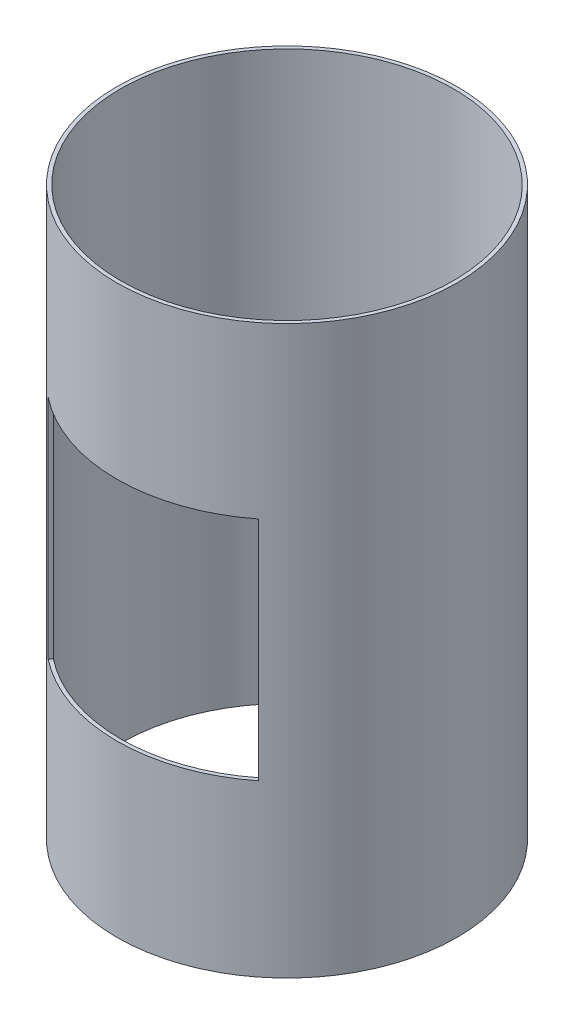
ISO-10303-21;
HEADER;
FILE_DESCRIPTION(('STEP AP214'),'2;1');
FILE_NAME('part.step','',(''),(''),'','','');
FILE_SCHEMA(('AUTOMOTIVE_DESIGN { 1 0 10303 214 1 1 1 1 }'));
ENDSEC;
DATA;
#1=APPLICATION_CONTEXT('core data for automotive mechanical design processes');
#2=APPLICATION_PROTOCOL_DEFINITION('international standard','automotive_design',2000,#1);
#3=PRODUCT_CONTEXT('',#1,'mechanical');
#4=PRODUCT('Part','Part','',(#3));
#5=PRODUCT_RELATED_PRODUCT_CATEGORY('part','',(#4));
#6=PRODUCT_DEFINITION_FORMATION('','',#4);
#7=PRODUCT_DEFINITION_CONTEXT('part definition',#1,'design');
#8=PRODUCT_DEFINITION('design','',#6,#7);
#9=PRODUCT_DEFINITION_SHAPE('','',#8);
#10=(LENGTH_UNIT() NAMED_UNIT(*) SI_UNIT(.MILLI.,.METRE.));
#11=(NAMED_UNIT(*) PLANE_ANGLE_UNIT() SI_UNIT($,.RADIAN.));
#12=(NAMED_UNIT(*) SI_UNIT($,.STERADIAN.) SOLID_ANGLE_UNIT());
#13=UNCERTAINTY_MEASURE_WITH_UNIT(LENGTH_MEASURE(1.E-05),#10,'distance_accuracy_value','');
#14=(GEOMETRIC_REPRESENTATION_CONTEXT(3) GLOBAL_UNCERTAINTY_ASSIGNED_CONTEXT((#13)) GLOBAL_UNIT_ASSIGNED_CONTEXT((#10,
#11,#12)) REPRESENTATION_CONTEXT('',''));
#15=CARTESIAN_POINT('',(0.,0.,0.));
#16=DIRECTION('',(0.,0.,1.));
#17=DIRECTION('',(1.,0.,0.));
#18=AXIS2_PLACEMENT_3D('',#15,#16,#17);
#19=CARTESIAN_POINT('',(0.,254.,0.));
#20=DIRECTION('',(0.,1.,0.));
#21=DIRECTION('',(0.,0.,1.));
#22=AXIS2_PLACEMENT_3D('',#19,#20,#21);
#23=PLANE('',#22);
#24=CARTESIAN_POINT('',(0.,254.,0.));
#25=DIRECTION('',(0.,1.,0.));
#26=DIRECTION('',(0.,0.,1.));
#27=AXIS2_PLACEMENT_3D('',#24,#25,#26);
#28=CIRCLE('',#27,76.2);
#29=CARTESIAN_POINT('',(0.,254.,76.2));
#30=VERTEX_POINT('',#29);
#31=EDGE_CURVE('E141',#30,#30,#28,.T.);
#32=ORIENTED_EDGE('',*,*,#31,.T.);
#33=EDGE_LOOP('',(#32));
#34=FACE_BOUND('',#33,.T.);
#35=CARTESIAN_POINT('',(0.,254.,0.));
#36=DIRECTION('',(0.,1.,0.));
#37=DIRECTION('',(0.,0.,1.));
#38=AXIS2_PLACEMENT_3D('',#35,#36,#37);
#39=CIRCLE('',#38,74.549);
#40=CARTESIAN_POINT('',(0.,254.,74.549));
#41=VERTEX_POINT('',#40);
#42=EDGE_CURVE('E135',#41,#41,#39,.T.);
#43=ORIENTED_EDGE('',*,*,#42,.F.);
#44=EDGE_LOOP('',(#43));
#45=FACE_BOUND('',#44,.T.);
#46=ADVANCED_FACE('F60',(#34,#45),#23,.T.);
#47=CARTESIAN_POINT('',(0.,0.,0.));
#48=DIRECTION('',(0.,1.,0.));
#49=DIRECTION('',(0.,0.,1.));
#50=AXIS2_PLACEMENT_3D('',#47,#48,#49);
#51=PLANE('',#50);
#52=CARTESIAN_POINT('',(0.,0.,0.));
#53=DIRECTION('',(0.,1.,0.));
#54=DIRECTION('',(0.,0.,1.));
#55=AXIS2_PLACEMENT_3D('',#52,#53,#54);
#56=CIRCLE('',#55,76.2);
#57=CARTESIAN_POINT('',(0.,0.,76.2));
#58=VERTEX_POINT('',#57);
#59=EDGE_CURVE('E138',#58,#58,#56,.T.);
#60=ORIENTED_EDGE('',*,*,#59,.F.);
#61=EDGE_LOOP('',(#60));
#62=FACE_BOUND('',#61,.T.);
#63=CARTESIAN_POINT('',(0.,0.,0.));
#64=DIRECTION('',(0.,1.,0.));
#65=DIRECTION('',(0.,0.,1.));
#66=AXIS2_PLACEMENT_3D('',#63,#64,#65);
#67=CIRCLE('',#66,74.549);
#68=CARTESIAN_POINT('',(0.,0.,74.549));
#69=VERTEX_POINT('',#68);
#70=EDGE_CURVE('E133',#69,#69,#67,.T.);
#71=ORIENTED_EDGE('',*,*,#70,.T.);
#72=EDGE_LOOP('',(#71));
#73=FACE_BOUND('',#72,.T.);
#74=ADVANCED_FACE('F165',(#62,#73),#51,.F.);
#75=CARTESIAN_POINT('',(0.,254.,0.));
#76=DIRECTION('',(0.,-1.,0.));
#77=DIRECTION('',(0.,0.,-1.));
#78=AXIS2_PLACEMENT_3D('',#75,#76,#77);
#79=CYLINDRICAL_SURFACE('',#78,76.2);
#80=CARTESIAN_POINT('',(0.,177.8,0.));
#81=DIRECTION('',(0.,-1.,0.));
#82=DIRECTION('',(-0.618369803069738,0.,0.785887260776947));
#83=AXIS2_PLACEMENT_3D('',#80,#81,#82);
#84=CIRCLE('',#83,76.2);
#85=CARTESIAN_POINT('',(47.119778993914,177.8,59.8846092712034));
#86=VERTEX_POINT('',#85);
#87=CARTESIAN_POINT('',(-47.119778993914,177.8,59.8846092712034));
#88=VERTEX_POINT('',#87);
#89=EDGE_CURVE('E106',#86,#88,#84,.T.);
#90=ORIENTED_EDGE('',*,*,#89,.F.);
#91=DIRECTION('',(0.,1.,0.));
#92=VECTOR('',#91,1.);
#93=CARTESIAN_POINT('',(47.119778993914,76.2,59.8846092712035));
#94=LINE('',#93,#92);
#95=CARTESIAN_POINT('',(47.119778993914,76.2,59.8846092712035));
#96=VERTEX_POINT('',#95);
#97=EDGE_CURVE('E113',#96,#86,#94,.T.);
#98=ORIENTED_EDGE('',*,*,#97,.F.);
#99=CARTESIAN_POINT('',(0.,76.2,0.));
#100=DIRECTION('',(0.,-1.,0.));
#101=DIRECTION('',(-0.618369803069738,0.,0.785887260776947));
#102=AXIS2_PLACEMENT_3D('',#99,#100,#101);
#103=CIRCLE('',#102,76.2);
#104=CARTESIAN_POINT('',(-47.119778993914,76.2,59.8846092712034));
#105=VERTEX_POINT('',#104);
#106=EDGE_CURVE('E118',#96,#105,#103,.T.);
#107=ORIENTED_EDGE('',*,*,#106,.T.);
#108=DIRECTION('',(0.,-1.,0.));
#109=VECTOR('',#108,1.);
#110=CARTESIAN_POINT('',(-47.119778993914,177.8,59.8846092712034));
#111=LINE('',#110,#109);
#112=EDGE_CURVE('E75',#88,#105,#111,.T.);
#113=ORIENTED_EDGE('',*,*,#112,.F.);
#114=EDGE_LOOP('',(#90,#98,#107,#113));
#115=FACE_BOUND('',#114,.T.);
#116=ORIENTED_EDGE('',*,*,#31,.F.);
#117=EDGE_LOOP('',(#116));
#118=FACE_BOUND('',#117,.T.);
#119=ORIENTED_EDGE('',*,*,#59,.T.);
#120=EDGE_LOOP('',(#119));
#121=FACE_BOUND('',#120,.T.);
#122=ADVANCED_FACE('F62',(#115,#118,#121),#79,.T.);
#123=CARTESIAN_POINT('',(0.,254.,0.));
#124=DIRECTION('',(0.,-1.,0.));
#125=DIRECTION('',(0.,0.,-1.));
#126=AXIS2_PLACEMENT_3D('',#123,#124,#125);
#127=CYLINDRICAL_SURFACE('',#126,74.549);
#128=DIRECTION('',(0.,-1.,0.));
#129=VECTOR('',#128,1.);
#130=CARTESIAN_POINT('',(46.0988504490458,254.,58.5871094036607));
#131=LINE('',#130,#129);
#132=CARTESIAN_POINT('',(46.0988504490458,177.8,58.5871094036607));
#133=VERTEX_POINT('',#132);
#134=CARTESIAN_POINT('',(46.0988504490458,76.2,58.5871094036607));
#135=VERTEX_POINT('',#134);
#136=EDGE_CURVE('E13',#133,#135,#131,.T.);
#137=ORIENTED_EDGE('',*,*,#136,.F.);
#138=CARTESIAN_POINT('',(0.,177.8,0.));
#139=DIRECTION('',(0.,1.,0.));
#140=DIRECTION('',(0.,0.,1.));
#141=AXIS2_PLACEMENT_3D('',#138,#139,#140);
#142=CIRCLE('',#141,74.549);
#143=CARTESIAN_POINT('',(-46.0988504490459,177.8,58.5871094036607));
#144=VERTEX_POINT('',#143);
#145=EDGE_CURVE('E68',#144,#133,#142,.T.);
#146=ORIENTED_EDGE('',*,*,#145,.F.);
#147=DIRECTION('',(0.,-1.,0.));
#148=VECTOR('',#147,1.);
#149=CARTESIAN_POINT('',(-46.0988504490459,254.,58.5871094036607));
#150=LINE('',#149,#148);
#151=CARTESIAN_POINT('',(-46.0988504490459,76.2,58.5871094036607));
#152=VERTEX_POINT('',#151);
#153=EDGE_CURVE('E148',#152,#144,#150,.F.);
#154=ORIENTED_EDGE('',*,*,#153,.F.);
#155=CARTESIAN_POINT('',(0.,76.2,0.));
#156=DIRECTION('',(0.,1.,0.));
#157=DIRECTION('',(0.,0.,1.));
#158=AXIS2_PLACEMENT_3D('',#155,#156,#157);
#159=CIRCLE('',#158,74.549);
#160=EDGE_CURVE('E144',#135,#152,#159,.F.);
#161=ORIENTED_EDGE('',*,*,#160,.F.);
#162=EDGE_LOOP('',(#137,#146,#154,#161));
#163=FACE_BOUND('',#162,.T.);
#164=ORIENTED_EDGE('',*,*,#42,.T.);
#165=EDGE_LOOP('',(#164));
#166=FACE_BOUND('',#165,.T.);
#167=ORIENTED_EDGE('',*,*,#70,.F.);
#168=EDGE_LOOP('',(#167));
#169=FACE_BOUND('',#168,.T.);
#170=ADVANCED_FACE('F153',(#163,#166,#169),#127,.F.);
#171=CARTESIAN_POINT('',(47.119778993914,127.,59.8846092712035));
#172=DIRECTION('',(0.785887260776948,0.,-0.618369803069737));
#173=DIRECTION('',(0.,1.,0.));
#174=AXIS2_PLACEMENT_3D('',#171,#172,#173);
#175=PLANE('',#174);
#176=ORIENTED_EDGE('',*,*,#136,.T.);
#177=DIRECTION('',(0.618369803069737,0.,0.785887260776948));
#178=VECTOR('',#177,1.);
#179=CARTESIAN_POINT('',(47.119778993914,76.2,59.8846092712035));
#180=LINE('',#179,#178);
#181=EDGE_CURVE('E83',#135,#96,#180,.T.);
#182=ORIENTED_EDGE('',*,*,#181,.T.);
#183=ORIENTED_EDGE('',*,*,#97,.T.);
#184=DIRECTION('',(0.618369803069737,0.,0.785887260776948));
#185=VECTOR('',#184,1.);
#186=CARTESIAN_POINT('',(47.119778993914,177.8,59.8846092712034));
#187=LINE('',#186,#185);
#188=EDGE_CURVE('E101',#133,#86,#187,.T.);
#189=ORIENTED_EDGE('',*,*,#188,.F.);
#190=EDGE_LOOP('',(#176,#182,#183,#189));
#191=FACE_BOUND('',#190,.T.);
#192=ADVANCED_FACE('F114',(#191),#175,.F.);
#193=CARTESIAN_POINT('',(0.,177.8,0.));
#194=DIRECTION('',(0.,1.,0.));
#195=DIRECTION('',(0.,0.,1.));
#196=AXIS2_PLACEMENT_3D('',#193,#194,#195);
#197=PLANE('',#196);
#198=ORIENTED_EDGE('',*,*,#145,.T.);
#199=ORIENTED_EDGE('',*,*,#188,.T.);
#200=ORIENTED_EDGE('',*,*,#89,.T.);
#201=DIRECTION('',(-0.618369803069738,0.,0.785887260776947));
#202=VECTOR('',#201,1.);
#203=CARTESIAN_POINT('',(-47.119778993914,177.8,59.8846092712034));
#204=LINE('',#203,#202);
#205=EDGE_CURVE('E110',#144,#88,#204,.T.);
#206=ORIENTED_EDGE('',*,*,#205,.F.);
#207=EDGE_LOOP('',(#198,#199,#200,#206));
#208=FACE_BOUND('',#207,.T.);
#209=ADVANCED_FACE('F103',(#208),#197,.F.);
#210=CARTESIAN_POINT('',(-47.119778993914,127.,59.8846092712034));
#211=DIRECTION('',(-0.785887260776947,0.,-0.618369803069738));
#212=DIRECTION('',(0.,-1.,0.));
#213=AXIS2_PLACEMENT_3D('',#210,#211,#212);
#214=PLANE('',#213);
#215=ORIENTED_EDGE('',*,*,#153,.T.);
#216=ORIENTED_EDGE('',*,*,#205,.T.);
#217=ORIENTED_EDGE('',*,*,#112,.T.);
#218=DIRECTION('',(-0.618369803069738,0.,0.785887260776947));
#219=VECTOR('',#218,1.);
#220=CARTESIAN_POINT('',(-47.119778993914,76.2,59.8846092712034));
#221=LINE('',#220,#219);
#222=EDGE_CURVE('E122',#152,#105,#221,.T.);
#223=ORIENTED_EDGE('',*,*,#222,.F.);
#224=EDGE_LOOP('',(#215,#216,#217,#223));
#225=FACE_BOUND('',#224,.T.);
#226=ADVANCED_FACE('F150',(#225),#214,.F.);
#227=CARTESIAN_POINT('',(0.,76.2,0.));
#228=DIRECTION('',(0.,1.,0.));
#229=DIRECTION('',(0.,0.,1.));
#230=AXIS2_PLACEMENT_3D('',#227,#228,#229);
#231=PLANE('',#230);
#232=ORIENTED_EDGE('',*,*,#160,.T.);
#233=ORIENTED_EDGE('',*,*,#222,.T.);
#234=ORIENTED_EDGE('',*,*,#106,.F.);
#235=ORIENTED_EDGE('',*,*,#181,.F.);
#236=EDGE_LOOP('',(#232,#233,#234,#235));
#237=FACE_BOUND('',#236,.T.);
#238=ADVANCED_FACE('F155',(#237),#231,.T.);
#239=CLOSED_SHELL('',(#46,#74,#122,#170,#192,#209,#226,#238));
#240=MANIFOLD_SOLID_BREP('B2',#239);
#241=ADVANCED_BREP_SHAPE_REPRESENTATION('',(#18,#240),#14);
#242=SHAPE_DEFINITION_REPRESENTATION(#9,#241);
ENDSEC;
END-ISO-10303-21;
